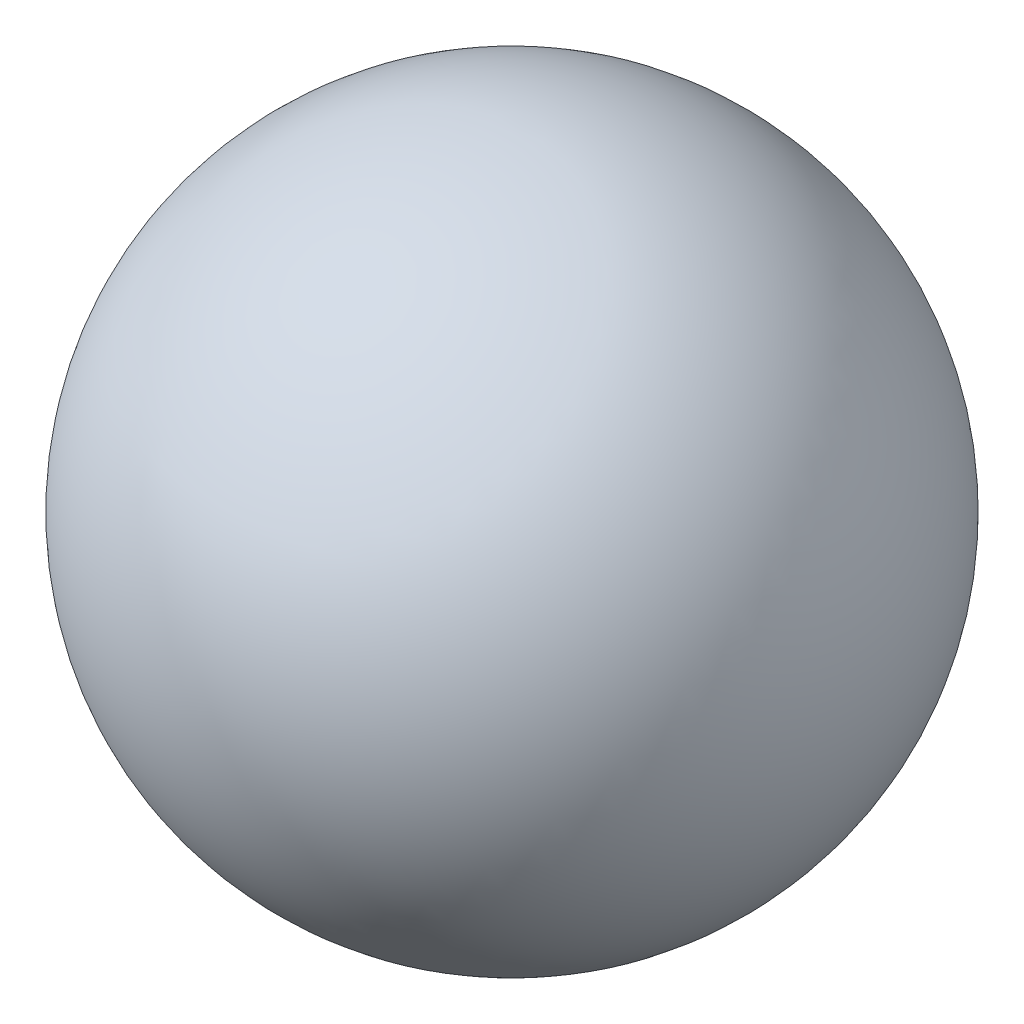
ISO-10303-21;
HEADER;
FILE_DESCRIPTION(('STEP AP214'),'2;1');
FILE_NAME('part.step','',(''),(''),'','','');
FILE_SCHEMA(('AUTOMOTIVE_DESIGN { 1 0 10303 214 1 1 1 1 }'));
ENDSEC;
DATA;
#1=APPLICATION_CONTEXT('core data for automotive mechanical design processes');
#2=APPLICATION_PROTOCOL_DEFINITION('international standard','automotive_design',2000,#1);
#3=PRODUCT_CONTEXT('',#1,'mechanical');
#4=PRODUCT('Part','Part','',(#3));
#5=PRODUCT_RELATED_PRODUCT_CATEGORY('part','',(#4));
#6=PRODUCT_DEFINITION_FORMATION('','',#4);
#7=PRODUCT_DEFINITION_CONTEXT('part definition',#1,'design');
#8=PRODUCT_DEFINITION('design','',#6,#7);
#9=PRODUCT_DEFINITION_SHAPE('','',#8);
#10=(LENGTH_UNIT() NAMED_UNIT(*) SI_UNIT(.MILLI.,.METRE.));
#11=(NAMED_UNIT(*) PLANE_ANGLE_UNIT() SI_UNIT($,.RADIAN.));
#12=(NAMED_UNIT(*) SI_UNIT($,.STERADIAN.) SOLID_ANGLE_UNIT());
#13=UNCERTAINTY_MEASURE_WITH_UNIT(LENGTH_MEASURE(1.E-05),#10,'distance_accuracy_value','');
#14=(GEOMETRIC_REPRESENTATION_CONTEXT(3) GLOBAL_UNCERTAINTY_ASSIGNED_CONTEXT((#13)) GLOBAL_UNIT_ASSIGNED_CONTEXT((#10,
#11,#12)) REPRESENTATION_CONTEXT('',''));
#15=CARTESIAN_POINT('',(0.,0.,0.));
#16=DIRECTION('',(0.,0.,1.));
#17=DIRECTION('',(1.,0.,0.));
#18=AXIS2_PLACEMENT_3D('',#15,#16,#17);
#19=CARTESIAN_POINT('',(0.,0.,0.));
#20=DIRECTION('',(0.,-1.,0.));
#21=DIRECTION('',(-1.,0.,0.));
#22=AXIS2_PLACEMENT_3D('',#19,#20,#21);
#23=SPHERICAL_SURFACE('',#22,2.03076923076923);
#24=CARTESIAN_POINT('',(0.,-2.03076923076923,0.));
#25=VERTEX_POINT('',#24);
#26=VERTEX_LOOP('',#25);
#27=FACE_BOUND('',#26,.T.);
#28=ADVANCED_FACE('F33',(#27),#23,.T.);
#29=CLOSED_SHELL('',(#28));
#30=MANIFOLD_SOLID_BREP('B2',#29);
#31=ADVANCED_BREP_SHAPE_REPRESENTATION('',(#18,#30),#14);
#32=SHAPE_DEFINITION_REPRESENTATION(#9,#31);
ENDSEC;
END-ISO-10303-21;
